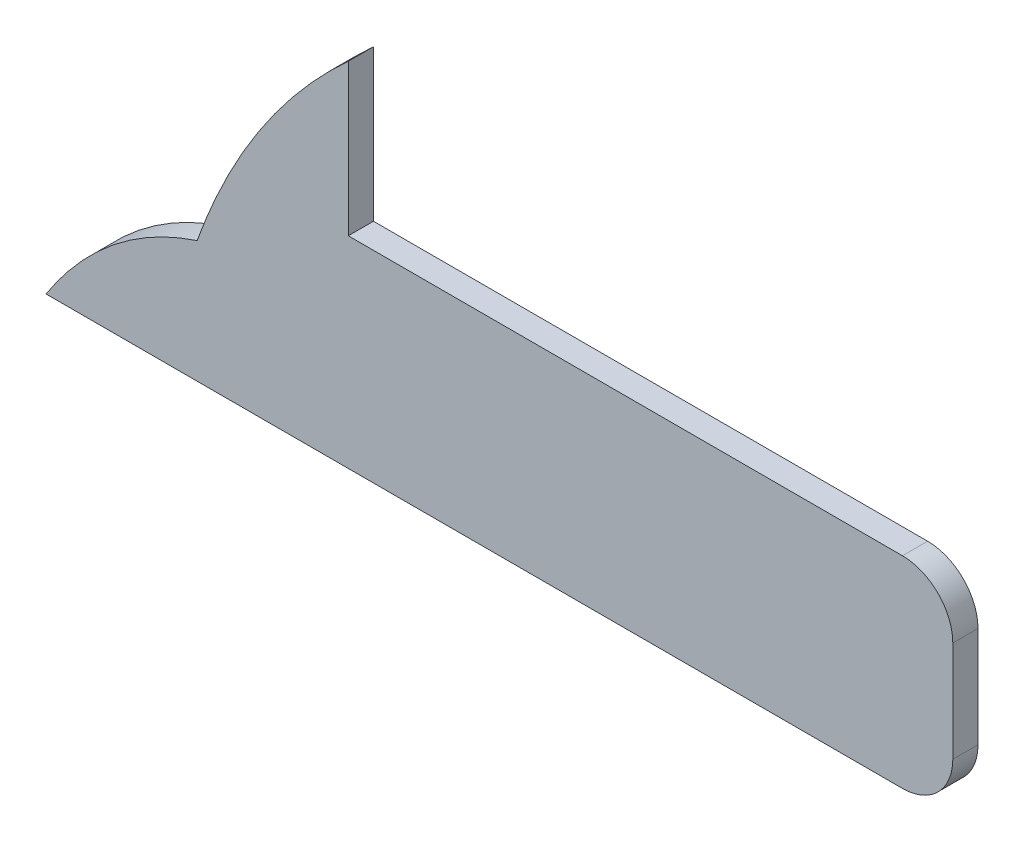
ISO-10303-21;
HEADER;
FILE_DESCRIPTION(('STEP AP214'),'2;1');
FILE_NAME('part.step','',(''),(''),'','','');
FILE_SCHEMA(('AUTOMOTIVE_DESIGN { 1 0 10303 214 1 1 1 1 }'));
ENDSEC;
DATA;
#1=APPLICATION_CONTEXT('core data for automotive mechanical design processes');
#2=APPLICATION_PROTOCOL_DEFINITION('international standard','automotive_design',2000,#1);
#3=PRODUCT_CONTEXT('',#1,'mechanical');
#4=PRODUCT('Part','Part','',(#3));
#5=PRODUCT_RELATED_PRODUCT_CATEGORY('part','',(#4));
#6=PRODUCT_DEFINITION_FORMATION('','',#4);
#7=PRODUCT_DEFINITION_CONTEXT('part definition',#1,'design');
#8=PRODUCT_DEFINITION('design','',#6,#7);
#9=PRODUCT_DEFINITION_SHAPE('','',#8);
#10=(LENGTH_UNIT() NAMED_UNIT(*) SI_UNIT(.MILLI.,.METRE.));
#11=(NAMED_UNIT(*) PLANE_ANGLE_UNIT() SI_UNIT($,.RADIAN.));
#12=(NAMED_UNIT(*) SI_UNIT($,.STERADIAN.) SOLID_ANGLE_UNIT());
#13=UNCERTAINTY_MEASURE_WITH_UNIT(LENGTH_MEASURE(1.E-05),#10,'distance_accuracy_value','');
#14=(GEOMETRIC_REPRESENTATION_CONTEXT(3) GLOBAL_UNCERTAINTY_ASSIGNED_CONTEXT((#13)) GLOBAL_UNIT_ASSIGNED_CONTEXT((#10,
#11,#12)) REPRESENTATION_CONTEXT('',''));
#15=CARTESIAN_POINT('',(0.,0.,0.));
#16=DIRECTION('',(0.,0.,1.));
#17=DIRECTION('',(1.,0.,0.));
#18=AXIS2_PLACEMENT_3D('',#15,#16,#17);
#19=CARTESIAN_POINT('',(76.2,61.4012568441146,12.7));
#20=CARTESIAN_POINT('',(29.7830167176041,46.1278484088482,12.7));
#21=CARTESIAN_POINT('',(0.,0.,12.7));
#22=B_SPLINE_CURVE_WITH_KNOTS('',2,(#19,#20,#21),.UNSPECIFIED.,.F.,.F.,(3,3),(0.,
0.939645983505003),.UNSPECIFIED.);
#23=DIRECTION('',(0.,0.,-1.));
#24=VECTOR('',#23,1.);
#25=SURFACE_OF_LINEAR_EXTRUSION('',#22,#24);
#26=CARTESIAN_POINT('',(76.2,61.4012568441146,0.));
#27=CARTESIAN_POINT('',(29.7830167176041,46.1278484088482,0.));
#28=CARTESIAN_POINT('',(0.,0.,0.));
#29=B_SPLINE_CURVE_WITH_KNOTS('',2,(#26,#27,#28),.UNSPECIFIED.,.F.,.F.,(3,3),(0.,
0.939645983505003),.UNSPECIFIED.);
#30=CARTESIAN_POINT('',(76.2,61.4012568441146,0.));
#31=VERTEX_POINT('',#30);
#32=CARTESIAN_POINT('',(0.,0.,0.));
#33=VERTEX_POINT('',#32);
#34=EDGE_CURVE('E143',#31,#33,#29,.T.);
#35=ORIENTED_EDGE('',*,*,#34,.T.);
#36=DIRECTION('',(0.,0.,-1.));
#37=VECTOR('',#36,1.);
#38=CARTESIAN_POINT('',(0.,0.,12.7));
#39=LINE('',#38,#37);
#40=CARTESIAN_POINT('',(0.,0.,12.7));
#41=VERTEX_POINT('',#40);
#42=EDGE_CURVE('E11',#41,#33,#39,.T.);
#43=ORIENTED_EDGE('',*,*,#42,.F.);
#44=CARTESIAN_POINT('',(76.2,61.4012568441146,12.7));
#45=VERTEX_POINT('',#44);
#46=EDGE_CURVE('E204',#45,#41,#22,.T.);
#47=ORIENTED_EDGE('',*,*,#46,.F.);
#48=DIRECTION('',(0.,0.,-1.));
#49=VECTOR('',#48,1.);
#50=CARTESIAN_POINT('',(76.2,61.4012568441146,12.7));
#51=LINE('',#50,#49);
#52=EDGE_CURVE('E136',#45,#31,#51,.T.);
#53=ORIENTED_EDGE('',*,*,#52,.T.);
#54=EDGE_LOOP('',(#35,#43,#47,#53));
#55=FACE_BOUND('',#54,.T.);
#56=ADVANCED_FACE('F43',(#55),#25,.F.);
#57=CARTESIAN_POINT('',(0.,0.,12.7));
#58=DIRECTION('',(0.,1.,0.));
#59=DIRECTION('',(0.,0.,1.));
#60=AXIS2_PLACEMENT_3D('',#57,#58,#59);
#61=PLANE('',#60);
#62=DIRECTION('',(1.,0.,0.));
#63=VECTOR('',#62,1.);
#64=CARTESIAN_POINT('',(0.,0.,0.));
#65=LINE('',#64,#63);
#66=CARTESIAN_POINT('',(431.8,0.,0.));
#67=VERTEX_POINT('',#66);
#68=EDGE_CURVE('E178',#33,#67,#65,.T.);
#69=ORIENTED_EDGE('',*,*,#68,.T.);
#70=DIRECTION('',(0.,0.,-1.));
#71=VECTOR('',#70,1.);
#72=CARTESIAN_POINT('',(431.8,0.,12.7));
#73=LINE('',#72,#71);
#74=CARTESIAN_POINT('',(431.8,0.,12.7));
#75=VERTEX_POINT('',#74);
#76=EDGE_CURVE('E52',#75,#67,#73,.T.);
#77=ORIENTED_EDGE('',*,*,#76,.F.);
#78=DIRECTION('',(1.,0.,0.));
#79=VECTOR('',#78,1.);
#80=CARTESIAN_POINT('',(0.,0.,12.7));
#81=LINE('',#80,#79);
#82=EDGE_CURVE('E103',#41,#75,#81,.T.);
#83=ORIENTED_EDGE('',*,*,#82,.F.);
#84=ORIENTED_EDGE('',*,*,#42,.T.);
#85=EDGE_LOOP('',(#69,#77,#83,#84));
#86=FACE_BOUND('',#85,.T.);
#87=ADVANCED_FACE('F171',(#86),#61,.F.);
#88=CARTESIAN_POINT('',(431.8,25.4,12.7));
#89=DIRECTION('',(0.,0.,-1.));
#90=DIRECTION('',(-1.,0.,0.));
#91=AXIS2_PLACEMENT_3D('',#88,#89,#90);
#92=CYLINDRICAL_SURFACE('',#91,25.4);
#93=CARTESIAN_POINT('',(431.8,25.4,0.));
#94=DIRECTION('',(0.,0.,1.));
#95=DIRECTION('',(1.,0.,0.));
#96=AXIS2_PLACEMENT_3D('',#93,#94,#95);
#97=CIRCLE('',#96,25.4);
#98=CARTESIAN_POINT('',(457.2,25.4,0.));
#99=VERTEX_POINT('',#98);
#100=EDGE_CURVE('E186',#67,#99,#97,.T.);
#101=ORIENTED_EDGE('',*,*,#100,.T.);
#102=DIRECTION('',(0.,0.,-1.));
#103=VECTOR('',#102,1.);
#104=CARTESIAN_POINT('',(457.2,25.4,12.7));
#105=LINE('',#104,#103);
#106=CARTESIAN_POINT('',(457.2,25.4,12.7));
#107=VERTEX_POINT('',#106);
#108=EDGE_CURVE('E190',#107,#99,#105,.T.);
#109=ORIENTED_EDGE('',*,*,#108,.F.);
#110=CARTESIAN_POINT('',(431.8,25.4,12.7));
#111=DIRECTION('',(0.,0.,1.));
#112=DIRECTION('',(1.,0.,0.));
#113=AXIS2_PLACEMENT_3D('',#110,#111,#112);
#114=CIRCLE('',#113,25.4);
#115=EDGE_CURVE('E189',#75,#107,#114,.T.);
#116=ORIENTED_EDGE('',*,*,#115,.F.);
#117=ORIENTED_EDGE('',*,*,#76,.T.);
#118=EDGE_LOOP('',(#101,#109,#116,#117));
#119=FACE_BOUND('',#118,.T.);
#120=ADVANCED_FACE('F168',(#119),#92,.T.);
#121=CARTESIAN_POINT('',(457.2,25.4,12.7));
#122=DIRECTION('',(-1.,0.,0.));
#123=DIRECTION('',(0.,-1.,0.));
#124=AXIS2_PLACEMENT_3D('',#121,#122,#123);
#125=PLANE('',#124);
#126=DIRECTION('',(0.,1.,0.));
#127=VECTOR('',#126,1.);
#128=CARTESIAN_POINT('',(457.2,25.4,0.));
#129=LINE('',#128,#127);
#130=CARTESIAN_POINT('',(457.2,76.2,0.));
#131=VERTEX_POINT('',#130);
#132=EDGE_CURVE('E193',#99,#131,#129,.T.);
#133=ORIENTED_EDGE('',*,*,#132,.T.);
#134=DIRECTION('',(0.,0.,-1.));
#135=VECTOR('',#134,1.);
#136=CARTESIAN_POINT('',(457.2,76.2,12.7));
#137=LINE('',#136,#135);
#138=CARTESIAN_POINT('',(457.2,76.2,12.7));
#139=VERTEX_POINT('',#138);
#140=EDGE_CURVE('E211',#139,#131,#137,.T.);
#141=ORIENTED_EDGE('',*,*,#140,.F.);
#142=DIRECTION('',(0.,1.,0.));
#143=VECTOR('',#142,1.);
#144=CARTESIAN_POINT('',(457.2,25.4,12.7));
#145=LINE('',#144,#143);
#146=EDGE_CURVE('E216',#107,#139,#145,.T.);
#147=ORIENTED_EDGE('',*,*,#146,.F.);
#148=ORIENTED_EDGE('',*,*,#108,.T.);
#149=EDGE_LOOP('',(#133,#141,#147,#148));
#150=FACE_BOUND('',#149,.T.);
#151=ADVANCED_FACE('F164',(#150),#125,.F.);
#152=CARTESIAN_POINT('',(431.8,76.2,12.7));
#153=DIRECTION('',(0.,0.,-1.));
#154=DIRECTION('',(-1.,0.,0.));
#155=AXIS2_PLACEMENT_3D('',#152,#153,#154);
#156=CYLINDRICAL_SURFACE('',#155,25.4);
#157=CARTESIAN_POINT('',(431.8,76.2,0.));
#158=DIRECTION('',(0.,0.,1.));
#159=DIRECTION('',(1.,0.,0.));
#160=AXIS2_PLACEMENT_3D('',#157,#158,#159);
#161=CIRCLE('',#160,25.4);
#162=CARTESIAN_POINT('',(431.8,101.6,0.));
#163=VERTEX_POINT('',#162);
#164=EDGE_CURVE('E195',#131,#163,#161,.T.);
#165=ORIENTED_EDGE('',*,*,#164,.T.);
#166=DIRECTION('',(0.,0.,-1.));
#167=VECTOR('',#166,1.);
#168=CARTESIAN_POINT('',(431.8,101.6,12.7));
#169=LINE('',#168,#167);
#170=CARTESIAN_POINT('',(431.8,101.6,12.7));
#171=VERTEX_POINT('',#170);
#172=EDGE_CURVE('E131',#171,#163,#169,.T.);
#173=ORIENTED_EDGE('',*,*,#172,.F.);
#174=CARTESIAN_POINT('',(431.8,76.2,12.7));
#175=DIRECTION('',(0.,0.,1.));
#176=DIRECTION('',(1.,0.,0.));
#177=AXIS2_PLACEMENT_3D('',#174,#175,#176);
#178=CIRCLE('',#177,25.4);
#179=EDGE_CURVE('E122',#139,#171,#178,.T.);
#180=ORIENTED_EDGE('',*,*,#179,.F.);
#181=ORIENTED_EDGE('',*,*,#140,.T.);
#182=EDGE_LOOP('',(#165,#173,#180,#181));
#183=FACE_BOUND('',#182,.T.);
#184=ADVANCED_FACE('F161',(#183),#156,.T.);
#185=CARTESIAN_POINT('',(431.8,101.6,12.7));
#186=DIRECTION('',(0.,-1.,0.));
#187=DIRECTION('',(1.,0.,0.));
#188=AXIS2_PLACEMENT_3D('',#185,#186,#187);
#189=PLANE('',#188);
#190=DIRECTION('',(-1.,0.,0.));
#191=VECTOR('',#190,1.);
#192=CARTESIAN_POINT('',(431.8,101.6,0.));
#193=LINE('',#192,#191);
#194=CARTESIAN_POINT('',(152.4,101.6,0.));
#195=VERTEX_POINT('',#194);
#196=EDGE_CURVE('E130',#163,#195,#193,.T.);
#197=ORIENTED_EDGE('',*,*,#196,.T.);
#198=DIRECTION('',(0.,0.,-1.));
#199=VECTOR('',#198,1.);
#200=CARTESIAN_POINT('',(152.4,101.6,12.7));
#201=LINE('',#200,#199);
#202=CARTESIAN_POINT('',(152.4,101.6,12.7));
#203=VERTEX_POINT('',#202);
#204=EDGE_CURVE('E127',#203,#195,#201,.T.);
#205=ORIENTED_EDGE('',*,*,#204,.F.);
#206=DIRECTION('',(-1.,0.,0.));
#207=VECTOR('',#206,1.);
#208=CARTESIAN_POINT('',(431.8,101.6,12.7));
#209=LINE('',#208,#207);
#210=EDGE_CURVE('E116',#171,#203,#209,.T.);
#211=ORIENTED_EDGE('',*,*,#210,.F.);
#212=ORIENTED_EDGE('',*,*,#172,.T.);
#213=EDGE_LOOP('',(#197,#205,#211,#212));
#214=FACE_BOUND('',#213,.T.);
#215=ADVANCED_FACE('F128',(#214),#189,.F.);
#216=CARTESIAN_POINT('',(152.4,101.6,12.7));
#217=DIRECTION('',(-1.,0.,0.));
#218=DIRECTION('',(0.,0.,1.));
#219=AXIS2_PLACEMENT_3D('',#216,#217,#218);
#220=PLANE('',#219);
#221=DIRECTION('',(0.,1.,0.));
#222=VECTOR('',#221,1.);
#223=CARTESIAN_POINT('',(152.4,101.6,0.));
#224=LINE('',#223,#222);
#225=CARTESIAN_POINT('',(152.4,177.8,0.));
#226=VERTEX_POINT('',#225);
#227=EDGE_CURVE('E89',#195,#226,#224,.T.);
#228=ORIENTED_EDGE('',*,*,#227,.T.);
#229=DIRECTION('',(0.,0.,-1.));
#230=VECTOR('',#229,1.);
#231=CARTESIAN_POINT('',(152.4,177.8,12.7));
#232=LINE('',#231,#230);
#233=CARTESIAN_POINT('',(152.4,177.8,12.7));
#234=VERTEX_POINT('',#233);
#235=EDGE_CURVE('E132',#234,#226,#232,.T.);
#236=ORIENTED_EDGE('',*,*,#235,.F.);
#237=DIRECTION('',(0.,1.,0.));
#238=VECTOR('',#237,1.);
#239=CARTESIAN_POINT('',(152.4,101.6,12.7));
#240=LINE('',#239,#238);
#241=EDGE_CURVE('E120',#203,#234,#240,.T.);
#242=ORIENTED_EDGE('',*,*,#241,.F.);
#243=ORIENTED_EDGE('',*,*,#204,.T.);
#244=EDGE_LOOP('',(#228,#236,#242,#243));
#245=FACE_BOUND('',#244,.T.);
#246=ADVANCED_FACE('F134',(#245),#220,.F.);
#247=CARTESIAN_POINT('',(152.4,177.8,12.7));
#248=CARTESIAN_POINT('',(101.247409754766,131.199229675779,12.7));
#249=CARTESIAN_POINT('',(76.2,61.4012568441146,12.7));
#250=B_SPLINE_CURVE_WITH_KNOTS('',2,(#247,#248,#249),.UNSPECIFIED.,.F.,.F.,(3,3),(0.,
0.857766608182316),.UNSPECIFIED.);
#251=DIRECTION('',(0.,0.,-1.));
#252=VECTOR('',#251,1.);
#253=SURFACE_OF_LINEAR_EXTRUSION('',#250,#252);
#254=CARTESIAN_POINT('',(152.4,177.8,0.));
#255=CARTESIAN_POINT('',(101.247409754766,131.199229675779,0.));
#256=CARTESIAN_POINT('',(76.2,61.4012568441146,0.));
#257=B_SPLINE_CURVE_WITH_KNOTS('',2,(#254,#255,#256),.UNSPECIFIED.,.F.,.F.,(3,3),(0.,
0.857766608182316),.UNSPECIFIED.);
#258=EDGE_CURVE('E95',#226,#31,#257,.T.);
#259=ORIENTED_EDGE('',*,*,#258,.T.);
#260=ORIENTED_EDGE('',*,*,#52,.F.);
#261=EDGE_CURVE('E60',#234,#45,#250,.T.);
#262=ORIENTED_EDGE('',*,*,#261,.F.);
#263=ORIENTED_EDGE('',*,*,#235,.T.);
#264=EDGE_LOOP('',(#259,#260,#262,#263));
#265=FACE_BOUND('',#264,.T.);
#266=ADVANCED_FACE('F151',(#265),#253,.F.);
#267=CARTESIAN_POINT('',(33.9415083588021,38.4142384154528,12.7));
#268=DIRECTION('',(0.,0.,1.));
#269=DIRECTION('',(1.,0.,0.));
#270=AXIS2_PLACEMENT_3D('',#267,#268,#269);
#271=PLANE('',#270);
#272=ORIENTED_EDGE('',*,*,#46,.T.);
#273=ORIENTED_EDGE('',*,*,#82,.T.);
#274=ORIENTED_EDGE('',*,*,#115,.T.);
#275=ORIENTED_EDGE('',*,*,#146,.T.);
#276=ORIENTED_EDGE('',*,*,#179,.T.);
#277=ORIENTED_EDGE('',*,*,#210,.T.);
#278=ORIENTED_EDGE('',*,*,#241,.T.);
#279=ORIENTED_EDGE('',*,*,#261,.T.);
#280=EDGE_LOOP('',(#272,#273,#274,#275,#276,#277,#278,#279));
#281=FACE_BOUND('',#280,.T.);
#282=ADVANCED_FACE('F118',(#281),#271,.T.);
#283=CARTESIAN_POINT('',(33.9415083588021,38.4142384154528,0.));
#284=DIRECTION('',(0.,0.,1.));
#285=DIRECTION('',(1.,0.,0.));
#286=AXIS2_PLACEMENT_3D('',#283,#284,#285);
#287=PLANE('',#286);
#288=ORIENTED_EDGE('',*,*,#34,.F.);
#289=ORIENTED_EDGE('',*,*,#258,.F.);
#290=ORIENTED_EDGE('',*,*,#227,.F.);
#291=ORIENTED_EDGE('',*,*,#196,.F.);
#292=ORIENTED_EDGE('',*,*,#164,.F.);
#293=ORIENTED_EDGE('',*,*,#132,.F.);
#294=ORIENTED_EDGE('',*,*,#100,.F.);
#295=ORIENTED_EDGE('',*,*,#68,.F.);
#296=EDGE_LOOP('',(#288,#289,#290,#291,#292,#293,#294,#295));
#297=FACE_BOUND('',#296,.T.);
#298=ADVANCED_FACE('F155',(#297),#287,.F.);
#299=CLOSED_SHELL('',(#56,#87,#120,#151,#184,#215,#246,#266,#282,#298));
#300=MANIFOLD_SOLID_BREP('B2',#299);
#301=ADVANCED_BREP_SHAPE_REPRESENTATION('',(#18,#300),#14);
#302=SHAPE_DEFINITION_REPRESENTATION(#9,#301);
ENDSEC;
END-ISO-10303-21;
